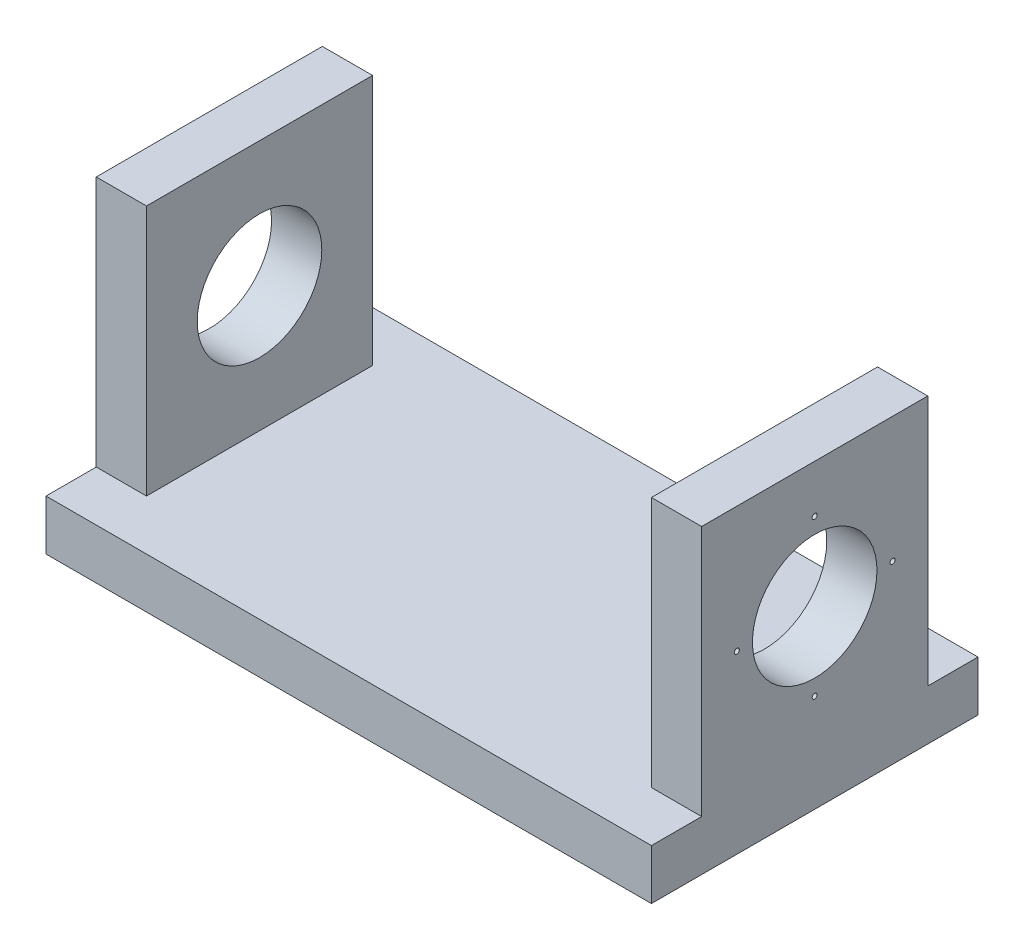
ISO-10303-21;
HEADER;
FILE_DESCRIPTION(('STEP AP214'),'2;1');
FILE_NAME('part.step','',(''),(''),'','','');
FILE_SCHEMA(('AUTOMOTIVE_DESIGN { 1 0 10303 214 1 1 1 1 }'));
ENDSEC;
DATA;
#1=APPLICATION_CONTEXT('core data for automotive mechanical design processes');
#2=APPLICATION_PROTOCOL_DEFINITION('international standard','automotive_design',2000,#1);
#3=PRODUCT_CONTEXT('',#1,'mechanical');
#4=PRODUCT('Part','Part','',(#3));
#5=PRODUCT_RELATED_PRODUCT_CATEGORY('part','',(#4));
#6=PRODUCT_DEFINITION_FORMATION('','',#4);
#7=PRODUCT_DEFINITION_CONTEXT('part definition',#1,'design');
#8=PRODUCT_DEFINITION('design','',#6,#7);
#9=PRODUCT_DEFINITION_SHAPE('','',#8);
#10=(LENGTH_UNIT() NAMED_UNIT(*) SI_UNIT(.MILLI.,.METRE.));
#11=(NAMED_UNIT(*) PLANE_ANGLE_UNIT() SI_UNIT($,.RADIAN.));
#12=(NAMED_UNIT(*) SI_UNIT($,.STERADIAN.) SOLID_ANGLE_UNIT());
#13=UNCERTAINTY_MEASURE_WITH_UNIT(LENGTH_MEASURE(1.E-05),#10,'distance_accuracy_value','');
#14=(GEOMETRIC_REPRESENTATION_CONTEXT(3) GLOBAL_UNCERTAINTY_ASSIGNED_CONTEXT((#13)) GLOBAL_UNIT_ASSIGNED_CONTEXT((#10,
#11,#12)) REPRESENTATION_CONTEXT('',''));
#15=CARTESIAN_POINT('',(0.,0.,0.));
#16=DIRECTION('',(0.,0.,1.));
#17=DIRECTION('',(1.,0.,0.));
#18=AXIS2_PLACEMENT_3D('',#15,#16,#17);
#19=CARTESIAN_POINT('',(0.,0.,0.));
#20=DIRECTION('',(0.,-1.,0.));
#21=DIRECTION('',(0.,0.,-1.));
#22=AXIS2_PLACEMENT_3D('',#19,#20,#21);
#23=PLANE('',#22);
#24=DIRECTION('',(-1.,0.,0.));
#25=VECTOR('',#24,1.);
#26=CARTESIAN_POINT('',(-100.5,0.,-44.9999999999998));
#27=LINE('',#26,#25);
#28=CARTESIAN_POINT('',(-100.5,0.,-44.9999999999998));
#29=VERTEX_POINT('',#28);
#30=CARTESIAN_POINT('',(-120.5,0.,-44.9999999999999));
#31=VERTEX_POINT('',#30);
#32=EDGE_CURVE('E54',#29,#31,#27,.T.);
#33=ORIENTED_EDGE('',*,*,#32,.F.);
#34=DIRECTION('',(0.,0.,-1.));
#35=VECTOR('',#34,1.);
#36=CARTESIAN_POINT('',(-100.5,0.,-44.9999999999998));
#37=LINE('',#36,#35);
#38=CARTESIAN_POINT('',(-100.5,0.,45.0000000000001));
#39=VERTEX_POINT('',#38);
#40=EDGE_CURVE('E59',#39,#29,#37,.T.);
#41=ORIENTED_EDGE('',*,*,#40,.F.);
#42=DIRECTION('',(1.,0.,0.));
#43=VECTOR('',#42,1.);
#44=CARTESIAN_POINT('',(-100.5,0.,45.0000000000001));
#45=LINE('',#44,#43);
#46=CARTESIAN_POINT('',(-120.5,0.,45.));
#47=VERTEX_POINT('',#46);
#48=EDGE_CURVE('E140',#47,#39,#45,.T.);
#49=ORIENTED_EDGE('',*,*,#48,.F.);
#50=DIRECTION('',(0.,0.,1.));
#51=VECTOR('',#50,1.);
#52=CARTESIAN_POINT('',(-120.5,0.,65.));
#53=LINE('',#52,#51);
#54=CARTESIAN_POINT('',(-120.5,0.,65.));
#55=VERTEX_POINT('',#54);
#56=EDGE_CURVE('E127',#47,#55,#53,.T.);
#57=ORIENTED_EDGE('',*,*,#56,.T.);
#58=DIRECTION('',(1.,0.,0.));
#59=VECTOR('',#58,1.);
#60=CARTESIAN_POINT('',(-120.5,0.,65.));
#61=LINE('',#60,#59);
#62=CARTESIAN_POINT('',(120.5,0.,65.));
#63=VERTEX_POINT('',#62);
#64=EDGE_CURVE('E201',#55,#63,#61,.T.);
#65=ORIENTED_EDGE('',*,*,#64,.T.);
#66=DIRECTION('',(0.,0.,-1.));
#67=VECTOR('',#66,1.);
#68=CARTESIAN_POINT('',(120.5,0.,65.));
#69=LINE('',#68,#67);
#70=CARTESIAN_POINT('',(120.5,0.,45.0000000000001));
#71=VERTEX_POINT('',#70);
#72=EDGE_CURVE('E210',#63,#71,#69,.T.);
#73=ORIENTED_EDGE('',*,*,#72,.T.);
#74=DIRECTION('',(1.,0.,0.));
#75=VECTOR('',#74,1.);
#76=CARTESIAN_POINT('',(100.5,0.,45.0000000000001));
#77=LINE('',#76,#75);
#78=CARTESIAN_POINT('',(100.5,0.,45.0000000000001));
#79=VERTEX_POINT('',#78);
#80=EDGE_CURVE('E180',#79,#71,#77,.T.);
#81=ORIENTED_EDGE('',*,*,#80,.F.);
#82=DIRECTION('',(0.,0.,1.));
#83=VECTOR('',#82,1.);
#84=CARTESIAN_POINT('',(100.5,0.,-44.9999999999998));
#85=LINE('',#84,#83);
#86=CARTESIAN_POINT('',(100.5,0.,-44.9999999999998));
#87=VERTEX_POINT('',#86);
#88=EDGE_CURVE('E159',#87,#79,#85,.T.);
#89=ORIENTED_EDGE('',*,*,#88,.F.);
#90=DIRECTION('',(-1.,0.,0.));
#91=VECTOR('',#90,1.);
#92=CARTESIAN_POINT('',(100.5,0.,-44.9999999999998));
#93=LINE('',#92,#91);
#94=CARTESIAN_POINT('',(120.5,0.,-44.9999999999998));
#95=VERTEX_POINT('',#94);
#96=EDGE_CURVE('E171',#95,#87,#93,.T.);
#97=ORIENTED_EDGE('',*,*,#96,.F.);
#98=CARTESIAN_POINT('',(120.5,0.,-65.));
#99=VERTEX_POINT('',#98);
#100=EDGE_CURVE('E196',#95,#99,#69,.T.);
#101=ORIENTED_EDGE('',*,*,#100,.T.);
#102=DIRECTION('',(-1.,0.,0.));
#103=VECTOR('',#102,1.);
#104=CARTESIAN_POINT('',(-120.5,0.,-65.));
#105=LINE('',#104,#103);
#106=CARTESIAN_POINT('',(-120.5,0.,-65.));
#107=VERTEX_POINT('',#106);
#108=EDGE_CURVE('E138',#99,#107,#105,.T.);
#109=ORIENTED_EDGE('',*,*,#108,.T.);
#110=EDGE_CURVE('E137',#107,#31,#53,.T.);
#111=ORIENTED_EDGE('',*,*,#110,.T.);
#112=EDGE_LOOP('',(#33,#41,#49,#57,#65,#73,#81,#89,#97,#101,#109,#111));
#113=FACE_BOUND('',#112,.T.);
#114=ADVANCED_FACE('F37',(#113),#23,.F.);
#115=CARTESIAN_POINT('',(120.5,-20.,65.));
#116=DIRECTION('',(1.,0.,0.));
#117=DIRECTION('',(0.,0.,-1.));
#118=AXIS2_PLACEMENT_3D('',#115,#116,#117);
#119=PLANE('',#118);
#120=CARTESIAN_POINT('',(120.5,80.9999999999997,-7.16822587542929E-13));
#121=DIRECTION('',(1.,0.,0.));
#122=DIRECTION('',(0.,0.,-1.));
#123=AXIS2_PLACEMENT_3D('',#120,#121,#122);
#124=CIRCLE('',#123,0.999999999999995);
#125=CARTESIAN_POINT('',(120.5,80.9999999999997,-1.00000000000071));
#126=VERTEX_POINT('',#125);
#127=EDGE_CURVE('E306',#126,#126,#124,.T.);
#128=ORIENTED_EDGE('',*,*,#127,.F.);
#129=EDGE_LOOP('',(#128));
#130=FACE_BOUND('',#129,.T.);
#131=CARTESIAN_POINT('',(120.5,49.9999999999996,30.9999999999993));
#132=DIRECTION('',(1.,0.,0.));
#133=DIRECTION('',(0.,0.,-1.));
#134=AXIS2_PLACEMENT_3D('',#131,#132,#133);
#135=CIRCLE('',#134,1.00000000000002);
#136=CARTESIAN_POINT('',(120.5,49.9999999999996,29.9999999999993));
#137=VERTEX_POINT('',#136);
#138=EDGE_CURVE('E442',#137,#137,#135,.T.);
#139=ORIENTED_EDGE('',*,*,#138,.F.);
#140=EDGE_LOOP('',(#139));
#141=FACE_BOUND('',#140,.T.);
#142=CARTESIAN_POINT('',(120.5,49.9999999999997,-31.0000000000008));
#143=DIRECTION('',(1.,0.,0.));
#144=DIRECTION('',(0.,0.,-1.));
#145=AXIS2_PLACEMENT_3D('',#142,#143,#144);
#146=CIRCLE('',#145,1.);
#147=CARTESIAN_POINT('',(120.5,49.9999999999997,-32.0000000000008));
#148=VERTEX_POINT('',#147);
#149=EDGE_CURVE('E449',#148,#148,#146,.T.);
#150=ORIENTED_EDGE('',*,*,#149,.F.);
#151=EDGE_LOOP('',(#150));
#152=FACE_BOUND('',#151,.T.);
#153=CARTESIAN_POINT('',(120.5,18.9999999999996,-8.03211816646574E-13));
#154=DIRECTION('',(1.,0.,0.));
#155=DIRECTION('',(0.,0.,-1.));
#156=AXIS2_PLACEMENT_3D('',#153,#154,#155);
#157=CIRCLE('',#156,0.999999999999998);
#158=CARTESIAN_POINT('',(120.5,18.9999999999996,-1.0000000000008));
#159=VERTEX_POINT('',#158);
#160=EDGE_CURVE('E454',#159,#159,#157,.T.);
#161=ORIENTED_EDGE('',*,*,#160,.F.);
#162=EDGE_LOOP('',(#161));
#163=FACE_BOUND('',#162,.T.);
#164=CARTESIAN_POINT('',(120.5,50.,1.52655665885959E-13));
#165=DIRECTION('',(1.,0.,0.));
#166=DIRECTION('',(0.,0.,-1.));
#167=AXIS2_PLACEMENT_3D('',#164,#165,#166);
#168=CIRCLE('',#167,24.7847763108502);
#169=CARTESIAN_POINT('',(120.5,50.,-24.78477631085));
#170=VERTEX_POINT('',#169);
#171=EDGE_CURVE('E253',#170,#170,#168,.T.);
#172=ORIENTED_EDGE('',*,*,#171,.F.);
#173=EDGE_LOOP('',(#172));
#174=FACE_BOUND('',#173,.T.);
#175=ORIENTED_EDGE('',*,*,#72,.F.);
#176=DIRECTION('',(0.,1.,0.));
#177=VECTOR('',#176,1.);
#178=CARTESIAN_POINT('',(120.5,-20.,65.));
#179=LINE('',#178,#177);
#180=CARTESIAN_POINT('',(120.5,-20.,65.));
#181=VERTEX_POINT('',#180);
#182=EDGE_CURVE('E11',#181,#63,#179,.T.);
#183=ORIENTED_EDGE('',*,*,#182,.F.);
#184=DIRECTION('',(0.,0.,-1.));
#185=VECTOR('',#184,1.);
#186=CARTESIAN_POINT('',(120.5,-20.,65.));
#187=LINE('',#186,#185);
#188=CARTESIAN_POINT('',(120.5,-20.,-65.));
#189=VERTEX_POINT('',#188);
#190=EDGE_CURVE('E197',#181,#189,#187,.T.);
#191=ORIENTED_EDGE('',*,*,#190,.T.);
#192=DIRECTION('',(0.,1.,0.));
#193=VECTOR('',#192,1.);
#194=CARTESIAN_POINT('',(120.5,-20.,-65.));
#195=LINE('',#194,#193);
#196=EDGE_CURVE('E209',#189,#99,#195,.T.);
#197=ORIENTED_EDGE('',*,*,#196,.T.);
#198=ORIENTED_EDGE('',*,*,#100,.F.);
#199=DIRECTION('',(0.,-1.,0.));
#200=VECTOR('',#199,1.);
#201=CARTESIAN_POINT('',(120.5,100.,-44.9999999999998));
#202=LINE('',#201,#200);
#203=CARTESIAN_POINT('',(120.5,100.,-44.9999999999998));
#204=VERTEX_POINT('',#203);
#205=EDGE_CURVE('E187',#204,#95,#202,.T.);
#206=ORIENTED_EDGE('',*,*,#205,.F.);
#207=DIRECTION('',(0.,0.,-1.));
#208=VECTOR('',#207,1.);
#209=CARTESIAN_POINT('',(120.5,100.,-44.9999999999998));
#210=LINE('',#209,#208);
#211=CARTESIAN_POINT('',(120.5,100.,45.0000000000001));
#212=VERTEX_POINT('',#211);
#213=EDGE_CURVE('E173',#212,#204,#210,.T.);
#214=ORIENTED_EDGE('',*,*,#213,.F.);
#215=DIRECTION('',(0.,-1.,0.));
#216=VECTOR('',#215,1.);
#217=CARTESIAN_POINT('',(120.5,100.,45.0000000000001));
#218=LINE('',#217,#216);
#219=EDGE_CURVE('E190',#212,#71,#218,.T.);
#220=ORIENTED_EDGE('',*,*,#219,.T.);
#221=EDGE_LOOP('',(#175,#183,#191,#197,#198,#206,#214,#220));
#222=FACE_BOUND('',#221,.T.);
#223=ADVANCED_FACE('F39',(#130,#141,#152,#163,#174,#222),#119,.T.);
#224=CARTESIAN_POINT('',(-120.5,-20.,65.));
#225=DIRECTION('',(0.,0.,1.));
#226=DIRECTION('',(1.,0.,0.));
#227=AXIS2_PLACEMENT_3D('',#224,#225,#226);
#228=PLANE('',#227);
#229=ORIENTED_EDGE('',*,*,#64,.F.);
#230=DIRECTION('',(0.,1.,0.));
#231=VECTOR('',#230,1.);
#232=CARTESIAN_POINT('',(-120.5,-20.,65.));
#233=LINE('',#232,#231);
#234=CARTESIAN_POINT('',(-120.5,-20.,65.));
#235=VERTEX_POINT('',#234);
#236=EDGE_CURVE('E46',#235,#55,#233,.T.);
#237=ORIENTED_EDGE('',*,*,#236,.F.);
#238=DIRECTION('',(1.,0.,0.));
#239=VECTOR('',#238,1.);
#240=CARTESIAN_POINT('',(-120.5,-20.,65.));
#241=LINE('',#240,#239);
#242=EDGE_CURVE('E206',#235,#181,#241,.T.);
#243=ORIENTED_EDGE('',*,*,#242,.T.);
#244=ORIENTED_EDGE('',*,*,#182,.T.);
#245=EDGE_LOOP('',(#229,#237,#243,#244));
#246=FACE_BOUND('',#245,.T.);
#247=ADVANCED_FACE('F242',(#246),#228,.T.);
#248=CARTESIAN_POINT('',(-120.5,-20.,65.));
#249=DIRECTION('',(-1.,0.,0.));
#250=DIRECTION('',(0.,0.,1.));
#251=AXIS2_PLACEMENT_3D('',#248,#249,#250);
#252=PLANE('',#251);
#253=CARTESIAN_POINT('',(-120.5,50.,1.52655665885959E-13));
#254=DIRECTION('',(1.,0.,0.));
#255=DIRECTION('',(0.,0.,-1.));
#256=AXIS2_PLACEMENT_3D('',#253,#254,#255);
#257=CIRCLE('',#256,24.7847763108502);
#258=CARTESIAN_POINT('',(-120.5,50.,-24.78477631085));
#259=VERTEX_POINT('',#258);
#260=EDGE_CURVE('E303',#259,#259,#257,.T.);
#261=ORIENTED_EDGE('',*,*,#260,.T.);
#262=EDGE_LOOP('',(#261));
#263=FACE_BOUND('',#262,.T.);
#264=ORIENTED_EDGE('',*,*,#110,.F.);
#265=DIRECTION('',(0.,1.,0.));
#266=VECTOR('',#265,1.);
#267=CARTESIAN_POINT('',(-120.5,-20.,-65.));
#268=LINE('',#267,#266);
#269=CARTESIAN_POINT('',(-120.5,-20.,-65.));
#270=VERTEX_POINT('',#269);
#271=EDGE_CURVE('E216',#270,#107,#268,.T.);
#272=ORIENTED_EDGE('',*,*,#271,.F.);
#273=DIRECTION('',(0.,0.,1.));
#274=VECTOR('',#273,1.);
#275=CARTESIAN_POINT('',(-120.5,-20.,65.));
#276=LINE('',#275,#274);
#277=EDGE_CURVE('E204',#270,#235,#276,.T.);
#278=ORIENTED_EDGE('',*,*,#277,.T.);
#279=ORIENTED_EDGE('',*,*,#236,.T.);
#280=ORIENTED_EDGE('',*,*,#56,.F.);
#281=DIRECTION('',(0.,-1.,0.));
#282=VECTOR('',#281,1.);
#283=CARTESIAN_POINT('',(-120.5,100.,45.));
#284=LINE('',#283,#282);
#285=CARTESIAN_POINT('',(-120.5,100.,45.));
#286=VERTEX_POINT('',#285);
#287=EDGE_CURVE('E132',#286,#47,#284,.T.);
#288=ORIENTED_EDGE('',*,*,#287,.F.);
#289=DIRECTION('',(0.,0.,1.));
#290=VECTOR('',#289,1.);
#291=CARTESIAN_POINT('',(-120.5,100.,-44.9999999999999));
#292=LINE('',#291,#290);
#293=CARTESIAN_POINT('',(-120.5,100.,-44.9999999999999));
#294=VERTEX_POINT('',#293);
#295=EDGE_CURVE('E161',#294,#286,#292,.T.);
#296=ORIENTED_EDGE('',*,*,#295,.F.);
#297=DIRECTION('',(0.,-1.,0.));
#298=VECTOR('',#297,1.);
#299=CARTESIAN_POINT('',(-120.5,100.,-44.9999999999999));
#300=LINE('',#299,#298);
#301=EDGE_CURVE('E149',#294,#31,#300,.T.);
#302=ORIENTED_EDGE('',*,*,#301,.T.);
#303=EDGE_LOOP('',(#264,#272,#278,#279,#280,#288,#296,#302));
#304=FACE_BOUND('',#303,.T.);
#305=ADVANCED_FACE('F129',(#263,#304),#252,.T.);
#306=CARTESIAN_POINT('',(-120.5,-20.,-65.));
#307=DIRECTION('',(0.,0.,-1.));
#308=DIRECTION('',(-1.,0.,0.));
#309=AXIS2_PLACEMENT_3D('',#306,#307,#308);
#310=PLANE('',#309);
#311=ORIENTED_EDGE('',*,*,#108,.F.);
#312=ORIENTED_EDGE('',*,*,#196,.F.);
#313=DIRECTION('',(-1.,0.,0.));
#314=VECTOR('',#313,1.);
#315=CARTESIAN_POINT('',(-120.5,-20.,-65.));
#316=LINE('',#315,#314);
#317=EDGE_CURVE('E200',#189,#270,#316,.T.);
#318=ORIENTED_EDGE('',*,*,#317,.T.);
#319=ORIENTED_EDGE('',*,*,#271,.T.);
#320=EDGE_LOOP('',(#311,#312,#318,#319));
#321=FACE_BOUND('',#320,.T.);
#322=ADVANCED_FACE('F226',(#321),#310,.T.);
#323=CARTESIAN_POINT('',(0.,-20.,0.));
#324=DIRECTION('',(0.,-1.,0.));
#325=DIRECTION('',(0.,0.,-1.));
#326=AXIS2_PLACEMENT_3D('',#323,#324,#325);
#327=PLANE('',#326);
#328=CARTESIAN_POINT('',(0.,-20.,0.));
#329=DIRECTION('',(0.,-1.,0.));
#330=DIRECTION('',(0.,0.,-1.));
#331=AXIS2_PLACEMENT_3D('',#328,#329,#330);
#332=CIRCLE('',#331,15.5);
#333=CARTESIAN_POINT('',(0.,-20.,-15.5));
#334=VERTEX_POINT('',#333);
#335=EDGE_CURVE('E297',#334,#334,#332,.T.);
#336=ORIENTED_EDGE('',*,*,#335,.F.);
#337=EDGE_LOOP('',(#336));
#338=FACE_BOUND('',#337,.T.);
#339=ORIENTED_EDGE('',*,*,#190,.F.);
#340=ORIENTED_EDGE('',*,*,#242,.F.);
#341=ORIENTED_EDGE('',*,*,#277,.F.);
#342=ORIENTED_EDGE('',*,*,#317,.F.);
#343=EDGE_LOOP('',(#339,#340,#341,#342));
#344=FACE_BOUND('',#343,.T.);
#345=ADVANCED_FACE('F245',(#338,#344),#327,.T.);
#346=CARTESIAN_POINT('',(100.5,100.,-44.9999999999998));
#347=DIRECTION('',(1.,0.,0.));
#348=DIRECTION('',(0.,0.,-1.));
#349=AXIS2_PLACEMENT_3D('',#346,#347,#348);
#350=PLANE('',#349);
#351=CARTESIAN_POINT('',(100.5,80.9999999999997,-7.16822587542929E-13));
#352=DIRECTION('',(1.,0.,0.));
#353=DIRECTION('',(0.,0.,-1.));
#354=AXIS2_PLACEMENT_3D('',#351,#352,#353);
#355=CIRCLE('',#354,0.999999999999995);
#356=CARTESIAN_POINT('',(100.5,80.9999999999997,-1.00000000000071));
#357=VERTEX_POINT('',#356);
#358=EDGE_CURVE('E300',#357,#357,#355,.F.);
#359=ORIENTED_EDGE('',*,*,#358,.F.);
#360=EDGE_LOOP('',(#359));
#361=FACE_BOUND('',#360,.T.);
#362=CARTESIAN_POINT('',(100.5,49.9999999999996,30.9999999999993));
#363=DIRECTION('',(1.,0.,0.));
#364=DIRECTION('',(0.,0.,-1.));
#365=AXIS2_PLACEMENT_3D('',#362,#363,#364);
#366=CIRCLE('',#365,1.00000000000002);
#367=CARTESIAN_POINT('',(100.5,49.9999999999996,29.9999999999993));
#368=VERTEX_POINT('',#367);
#369=EDGE_CURVE('E445',#368,#368,#366,.F.);
#370=ORIENTED_EDGE('',*,*,#369,.F.);
#371=EDGE_LOOP('',(#370));
#372=FACE_BOUND('',#371,.T.);
#373=CARTESIAN_POINT('',(100.5,49.9999999999997,-31.0000000000008));
#374=DIRECTION('',(1.,0.,0.));
#375=DIRECTION('',(0.,0.,-1.));
#376=AXIS2_PLACEMENT_3D('',#373,#374,#375);
#377=CIRCLE('',#376,1.);
#378=CARTESIAN_POINT('',(100.5,49.9999999999997,-32.0000000000008));
#379=VERTEX_POINT('',#378);
#380=EDGE_CURVE('E451',#379,#379,#377,.F.);
#381=ORIENTED_EDGE('',*,*,#380,.F.);
#382=EDGE_LOOP('',(#381));
#383=FACE_BOUND('',#382,.T.);
#384=CARTESIAN_POINT('',(100.5,18.9999999999996,-8.03211816646574E-13));
#385=DIRECTION('',(1.,0.,0.));
#386=DIRECTION('',(0.,0.,-1.));
#387=AXIS2_PLACEMENT_3D('',#384,#385,#386);
#388=CIRCLE('',#387,0.999999999999998);
#389=CARTESIAN_POINT('',(100.5,18.9999999999996,-1.0000000000008));
#390=VERTEX_POINT('',#389);
#391=EDGE_CURVE('E457',#390,#390,#388,.F.);
#392=ORIENTED_EDGE('',*,*,#391,.F.);
#393=EDGE_LOOP('',(#392));
#394=FACE_BOUND('',#393,.T.);
#395=CARTESIAN_POINT('',(100.5,50.,1.52655665885959E-13));
#396=DIRECTION('',(1.,0.,0.));
#397=DIRECTION('',(0.,0.,-1.));
#398=AXIS2_PLACEMENT_3D('',#395,#396,#397);
#399=CIRCLE('',#398,24.7847763108502);
#400=CARTESIAN_POINT('',(100.5,50.,-24.78477631085));
#401=VERTEX_POINT('',#400);
#402=EDGE_CURVE('E312',#401,#401,#399,.T.);
#403=ORIENTED_EDGE('',*,*,#402,.T.);
#404=EDGE_LOOP('',(#403));
#405=FACE_BOUND('',#404,.T.);
#406=ORIENTED_EDGE('',*,*,#88,.T.);
#407=DIRECTION('',(0.,-1.,0.));
#408=VECTOR('',#407,1.);
#409=CARTESIAN_POINT('',(100.5,100.,45.0000000000001));
#410=LINE('',#409,#408);
#411=CARTESIAN_POINT('',(100.5,100.,45.0000000000001));
#412=VERTEX_POINT('',#411);
#413=EDGE_CURVE('E193',#412,#79,#410,.T.);
#414=ORIENTED_EDGE('',*,*,#413,.F.);
#415=DIRECTION('',(0.,0.,1.));
#416=VECTOR('',#415,1.);
#417=CARTESIAN_POINT('',(100.5,100.,-44.9999999999998));
#418=LINE('',#417,#416);
#419=CARTESIAN_POINT('',(100.5,100.,-44.9999999999998));
#420=VERTEX_POINT('',#419);
#421=EDGE_CURVE('E167',#420,#412,#418,.T.);
#422=ORIENTED_EDGE('',*,*,#421,.F.);
#423=DIRECTION('',(0.,-1.,0.));
#424=VECTOR('',#423,1.);
#425=CARTESIAN_POINT('',(100.5,100.,-44.9999999999998));
#426=LINE('',#425,#424);
#427=EDGE_CURVE('E177',#420,#87,#426,.T.);
#428=ORIENTED_EDGE('',*,*,#427,.T.);
#429=EDGE_LOOP('',(#406,#414,#422,#428));
#430=FACE_BOUND('',#429,.T.);
#431=ADVANCED_FACE('F233',(#361,#372,#383,#394,#405,#430),#350,.F.);
#432=CARTESIAN_POINT('',(100.5,100.,45.0000000000001));
#433=DIRECTION('',(0.,0.,-1.));
#434=DIRECTION('',(-1.,0.,0.));
#435=AXIS2_PLACEMENT_3D('',#432,#433,#434);
#436=PLANE('',#435);
#437=ORIENTED_EDGE('',*,*,#80,.T.);
#438=ORIENTED_EDGE('',*,*,#219,.F.);
#439=DIRECTION('',(1.,0.,0.));
#440=VECTOR('',#439,1.);
#441=CARTESIAN_POINT('',(100.5,100.,45.0000000000001));
#442=LINE('',#441,#440);
#443=EDGE_CURVE('E170',#412,#212,#442,.T.);
#444=ORIENTED_EDGE('',*,*,#443,.F.);
#445=ORIENTED_EDGE('',*,*,#413,.T.);
#446=EDGE_LOOP('',(#437,#438,#444,#445));
#447=FACE_BOUND('',#446,.T.);
#448=ADVANCED_FACE('F240',(#447),#436,.F.);
#449=CARTESIAN_POINT('',(100.5,100.,-44.9999999999998));
#450=DIRECTION('',(0.,0.,1.));
#451=DIRECTION('',(1.,0.,0.));
#452=AXIS2_PLACEMENT_3D('',#449,#450,#451);
#453=PLANE('',#452);
#454=ORIENTED_EDGE('',*,*,#96,.T.);
#455=ORIENTED_EDGE('',*,*,#427,.F.);
#456=DIRECTION('',(-1.,0.,0.));
#457=VECTOR('',#456,1.);
#458=CARTESIAN_POINT('',(100.5,100.,-44.9999999999998));
#459=LINE('',#458,#457);
#460=EDGE_CURVE('E175',#204,#420,#459,.T.);
#461=ORIENTED_EDGE('',*,*,#460,.F.);
#462=ORIENTED_EDGE('',*,*,#205,.T.);
#463=EDGE_LOOP('',(#454,#455,#461,#462));
#464=FACE_BOUND('',#463,.T.);
#465=ADVANCED_FACE('F229',(#464),#453,.F.);
#466=CARTESIAN_POINT('',(0.,100.,0.));
#467=DIRECTION('',(0.,1.,0.));
#468=DIRECTION('',(0.,0.,1.));
#469=AXIS2_PLACEMENT_3D('',#466,#467,#468);
#470=PLANE('',#469);
#471=ORIENTED_EDGE('',*,*,#421,.T.);
#472=ORIENTED_EDGE('',*,*,#443,.T.);
#473=ORIENTED_EDGE('',*,*,#213,.T.);
#474=ORIENTED_EDGE('',*,*,#460,.T.);
#475=EDGE_LOOP('',(#471,#472,#473,#474));
#476=FACE_BOUND('',#475,.T.);
#477=ADVANCED_FACE('F236',(#476),#470,.T.);
#478=CARTESIAN_POINT('',(-100.5,100.,-44.9999999999998));
#479=DIRECTION('',(-1.,0.,0.));
#480=DIRECTION('',(0.,0.,1.));
#481=AXIS2_PLACEMENT_3D('',#478,#479,#480);
#482=PLANE('',#481);
#483=CARTESIAN_POINT('',(-100.5,50.,1.52655665885959E-13));
#484=DIRECTION('',(-1.,0.,0.));
#485=DIRECTION('',(0.,0.,1.));
#486=AXIS2_PLACEMENT_3D('',#483,#484,#485);
#487=CIRCLE('',#486,24.7847763108502);
#488=CARTESIAN_POINT('',(-100.5,50.,24.7847763108504));
#489=VERTEX_POINT('',#488);
#490=EDGE_CURVE('E41',#489,#489,#487,.T.);
#491=ORIENTED_EDGE('',*,*,#490,.T.);
#492=EDGE_LOOP('',(#491));
#493=FACE_BOUND('',#492,.T.);
#494=ORIENTED_EDGE('',*,*,#40,.T.);
#495=DIRECTION('',(0.,-1.,0.));
#496=VECTOR('',#495,1.);
#497=CARTESIAN_POINT('',(-100.5,100.,-44.9999999999998));
#498=LINE('',#497,#496);
#499=CARTESIAN_POINT('',(-100.5,100.,-44.9999999999998));
#500=VERTEX_POINT('',#499);
#501=EDGE_CURVE('E153',#500,#29,#498,.T.);
#502=ORIENTED_EDGE('',*,*,#501,.F.);
#503=DIRECTION('',(0.,0.,-1.));
#504=VECTOR('',#503,1.);
#505=CARTESIAN_POINT('',(-100.5,100.,-44.9999999999998));
#506=LINE('',#505,#504);
#507=CARTESIAN_POINT('',(-100.5,100.,45.0000000000001));
#508=VERTEX_POINT('',#507);
#509=EDGE_CURVE('E144',#508,#500,#506,.T.);
#510=ORIENTED_EDGE('',*,*,#509,.F.);
#511=DIRECTION('',(0.,-1.,0.));
#512=VECTOR('',#511,1.);
#513=CARTESIAN_POINT('',(-100.5,100.,45.0000000000001));
#514=LINE('',#513,#512);
#515=EDGE_CURVE('E148',#508,#39,#514,.T.);
#516=ORIENTED_EDGE('',*,*,#515,.T.);
#517=EDGE_LOOP('',(#494,#502,#510,#516));
#518=FACE_BOUND('',#517,.T.);
#519=ADVANCED_FACE('F254',(#493,#518),#482,.F.);
#520=CARTESIAN_POINT('',(-100.5,100.,-44.9999999999998));
#521=DIRECTION('',(0.,0.,1.));
#522=DIRECTION('',(1.,0.,0.));
#523=AXIS2_PLACEMENT_3D('',#520,#521,#522);
#524=PLANE('',#523);
#525=ORIENTED_EDGE('',*,*,#32,.T.);
#526=ORIENTED_EDGE('',*,*,#301,.F.);
#527=DIRECTION('',(-1.,0.,0.));
#528=VECTOR('',#527,1.);
#529=CARTESIAN_POINT('',(-100.5,100.,-44.9999999999998));
#530=LINE('',#529,#528);
#531=EDGE_CURVE('E163',#500,#294,#530,.T.);
#532=ORIENTED_EDGE('',*,*,#531,.F.);
#533=ORIENTED_EDGE('',*,*,#501,.T.);
#534=EDGE_LOOP('',(#525,#526,#532,#533));
#535=FACE_BOUND('',#534,.T.);
#536=ADVANCED_FACE('F249',(#535),#524,.F.);
#537=CARTESIAN_POINT('',(-100.5,100.,45.0000000000001));
#538=DIRECTION('',(0.,0.,-1.));
#539=DIRECTION('',(-1.,0.,0.));
#540=AXIS2_PLACEMENT_3D('',#537,#538,#539);
#541=PLANE('',#540);
#542=ORIENTED_EDGE('',*,*,#48,.T.);
#543=ORIENTED_EDGE('',*,*,#515,.F.);
#544=DIRECTION('',(1.,0.,0.));
#545=VECTOR('',#544,1.);
#546=CARTESIAN_POINT('',(-100.5,100.,45.0000000000001));
#547=LINE('',#546,#545);
#548=EDGE_CURVE('E147',#286,#508,#547,.T.);
#549=ORIENTED_EDGE('',*,*,#548,.F.);
#550=ORIENTED_EDGE('',*,*,#287,.T.);
#551=EDGE_LOOP('',(#542,#543,#549,#550));
#552=FACE_BOUND('',#551,.T.);
#553=ADVANCED_FACE('F146',(#552),#541,.F.);
#554=CARTESIAN_POINT('',(0.,100.,0.));
#555=DIRECTION('',(0.,-1.,0.));
#556=DIRECTION('',(0.,0.,-1.));
#557=AXIS2_PLACEMENT_3D('',#554,#555,#556);
#558=PLANE('',#557);
#559=ORIENTED_EDGE('',*,*,#509,.T.);
#560=ORIENTED_EDGE('',*,*,#531,.T.);
#561=ORIENTED_EDGE('',*,*,#295,.T.);
#562=ORIENTED_EDGE('',*,*,#548,.T.);
#563=EDGE_LOOP('',(#559,#560,#561,#562));
#564=FACE_BOUND('',#563,.T.);
#565=ADVANCED_FACE('F256',(#564),#558,.F.);
#566=CARTESIAN_POINT('',(-120.5,50.,1.52655665885959E-13));
#567=DIRECTION('',(1.,0.,0.));
#568=DIRECTION('',(0.,0.,-1.));
#569=AXIS2_PLACEMENT_3D('',#566,#567,#568);
#570=CYLINDRICAL_SURFACE('',#569,24.7847763108502);
#571=ORIENTED_EDGE('',*,*,#260,.F.);
#572=EDGE_LOOP('',(#571));
#573=FACE_BOUND('',#572,.T.);
#574=ORIENTED_EDGE('',*,*,#490,.F.);
#575=EDGE_LOOP('',(#574));
#576=FACE_BOUND('',#575,.T.);
#577=ADVANCED_FACE('F258',(#573,#576),#570,.F.);
#578=ORIENTED_EDGE('',*,*,#171,.T.);
#579=EDGE_LOOP('',(#578));
#580=FACE_BOUND('',#579,.T.);
#581=ORIENTED_EDGE('',*,*,#402,.F.);
#582=EDGE_LOOP('',(#581));
#583=FACE_BOUND('',#582,.T.);
#584=ADVANCED_FACE('F264',(#580,#583),#570,.F.);
#585=CARTESIAN_POINT('',(0.,-10.,0.));
#586=DIRECTION('',(0.,-1.,0.));
#587=DIRECTION('',(0.,0.,-1.));
#588=AXIS2_PLACEMENT_3D('',#585,#586,#587);
#589=CYLINDRICAL_SURFACE('',#588,15.5);
#590=CARTESIAN_POINT('',(0.,-10.,0.));
#591=DIRECTION('',(0.,-1.,0.));
#592=DIRECTION('',(0.,0.,-1.));
#593=AXIS2_PLACEMENT_3D('',#590,#591,#592);
#594=CIRCLE('',#593,15.5);
#595=CARTESIAN_POINT('',(0.,-10.,-15.5));
#596=VERTEX_POINT('',#595);
#597=EDGE_CURVE('E299',#596,#596,#594,.T.);
#598=ORIENTED_EDGE('',*,*,#597,.F.);
#599=EDGE_LOOP('',(#598));
#600=FACE_BOUND('',#599,.T.);
#601=ORIENTED_EDGE('',*,*,#335,.T.);
#602=EDGE_LOOP('',(#601));
#603=FACE_BOUND('',#602,.T.);
#604=ADVANCED_FACE('F321',(#600,#603),#589,.F.);
#605=CARTESIAN_POINT('',(0.,-10.,0.));
#606=DIRECTION('',(0.,-1.,0.));
#607=DIRECTION('',(0.,0.,-1.));
#608=AXIS2_PLACEMENT_3D('',#605,#606,#607);
#609=PLANE('',#608);
#610=ORIENTED_EDGE('',*,*,#597,.T.);
#611=EDGE_LOOP('',(#610));
#612=FACE_BOUND('',#611,.T.);
#613=ADVANCED_FACE('F326',(#612),#609,.T.);
#614=CARTESIAN_POINT('',(97.6715728752538,18.9999999999996,-8.03211816646574E-13));
#615=DIRECTION('',(1.,0.,0.));
#616=DIRECTION('',(0.,0.,-1.));
#617=AXIS2_PLACEMENT_3D('',#614,#615,#616);
#618=CYLINDRICAL_SURFACE('',#617,0.999999999999998);
#619=ORIENTED_EDGE('',*,*,#391,.T.);
#620=EDGE_LOOP('',(#619));
#621=FACE_BOUND('',#620,.T.);
#622=ORIENTED_EDGE('',*,*,#160,.T.);
#623=EDGE_LOOP('',(#622));
#624=FACE_BOUND('',#623,.T.);
#625=ADVANCED_FACE('F386',(#621,#624),#618,.F.);
#626=CARTESIAN_POINT('',(97.6715728752538,49.9999999999997,-31.0000000000008));
#627=DIRECTION('',(1.,0.,0.));
#628=DIRECTION('',(0.,0.,-1.));
#629=AXIS2_PLACEMENT_3D('',#626,#627,#628);
#630=CYLINDRICAL_SURFACE('',#629,1.);
#631=ORIENTED_EDGE('',*,*,#380,.T.);
#632=EDGE_LOOP('',(#631));
#633=FACE_BOUND('',#632,.T.);
#634=ORIENTED_EDGE('',*,*,#149,.T.);
#635=EDGE_LOOP('',(#634));
#636=FACE_BOUND('',#635,.T.);
#637=ADVANCED_FACE('F396',(#633,#636),#630,.F.);
#638=CARTESIAN_POINT('',(97.6715728752538,49.9999999999996,30.9999999999993));
#639=DIRECTION('',(1.,0.,0.));
#640=DIRECTION('',(0.,0.,-1.));
#641=AXIS2_PLACEMENT_3D('',#638,#639,#640);
#642=CYLINDRICAL_SURFACE('',#641,1.00000000000002);
#643=ORIENTED_EDGE('',*,*,#369,.T.);
#644=EDGE_LOOP('',(#643));
#645=FACE_BOUND('',#644,.T.);
#646=ORIENTED_EDGE('',*,*,#138,.T.);
#647=EDGE_LOOP('',(#646));
#648=FACE_BOUND('',#647,.T.);
#649=ADVANCED_FACE('F407',(#645,#648),#642,.F.);
#650=CARTESIAN_POINT('',(97.6715728752538,80.9999999999997,-7.16822587542929E-13));
#651=DIRECTION('',(1.,0.,0.));
#652=DIRECTION('',(0.,0.,-1.));
#653=AXIS2_PLACEMENT_3D('',#650,#651,#652);
#654=CYLINDRICAL_SURFACE('',#653,0.999999999999995);
#655=ORIENTED_EDGE('',*,*,#358,.T.);
#656=EDGE_LOOP('',(#655));
#657=FACE_BOUND('',#656,.T.);
#658=ORIENTED_EDGE('',*,*,#127,.T.);
#659=EDGE_LOOP('',(#658));
#660=FACE_BOUND('',#659,.T.);
#661=ADVANCED_FACE('F418',(#657,#660),#654,.F.);
#662=CLOSED_SHELL('',(#114,#223,#247,#305,#322,#345,#431,#448,#465,#477,#519,#536,#553,#565,
#577,#584,#604,#613,#625,#637,#649,#661));
#663=MANIFOLD_SOLID_BREP('B2',#662);
#664=ADVANCED_BREP_SHAPE_REPRESENTATION('',(#18,#663),#14);
#665=SHAPE_DEFINITION_REPRESENTATION(#9,#664);
ENDSEC;
END-ISO-10303-21;
